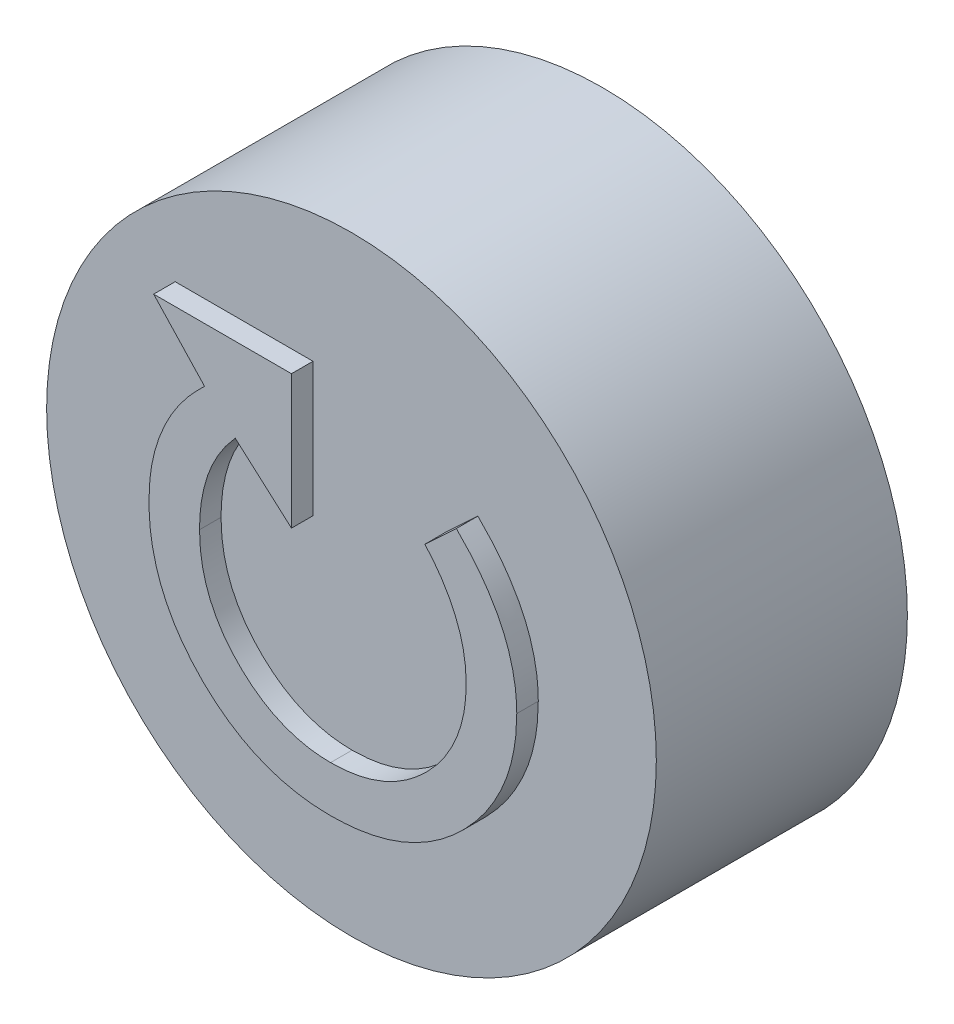
ISO-10303-21;
HEADER;
FILE_DESCRIPTION(('STEP AP214'),'2;1');
FILE_NAME('part.step','',(''),(''),'','','');
FILE_SCHEMA(('AUTOMOTIVE_DESIGN { 1 0 10303 214 1 1 1 1 }'));
ENDSEC;
DATA;
#1=APPLICATION_CONTEXT('core data for automotive mechanical design processes');
#2=APPLICATION_PROTOCOL_DEFINITION('international standard','automotive_design',2000,#1);
#3=PRODUCT_CONTEXT('',#1,'mechanical');
#4=PRODUCT('Part','Part','',(#3));
#5=PRODUCT_RELATED_PRODUCT_CATEGORY('part','',(#4));
#6=PRODUCT_DEFINITION_FORMATION('','',#4);
#7=PRODUCT_DEFINITION_CONTEXT('part definition',#1,'design');
#8=PRODUCT_DEFINITION('design','',#6,#7);
#9=PRODUCT_DEFINITION_SHAPE('','',#8);
#10=(LENGTH_UNIT() NAMED_UNIT(*) SI_UNIT(.MILLI.,.METRE.));
#11=(NAMED_UNIT(*) PLANE_ANGLE_UNIT() SI_UNIT($,.RADIAN.));
#12=(NAMED_UNIT(*) SI_UNIT($,.STERADIAN.) SOLID_ANGLE_UNIT());
#13=UNCERTAINTY_MEASURE_WITH_UNIT(LENGTH_MEASURE(1.E-05),#10,'distance_accuracy_value','');
#14=(GEOMETRIC_REPRESENTATION_CONTEXT(3) GLOBAL_UNCERTAINTY_ASSIGNED_CONTEXT((#13)) GLOBAL_UNIT_ASSIGNED_CONTEXT((#10,
#11,#12)) REPRESENTATION_CONTEXT('',''));
#15=CARTESIAN_POINT('',(0.,0.,0.));
#16=DIRECTION('',(0.,0.,1.));
#17=DIRECTION('',(1.,0.,0.));
#18=AXIS2_PLACEMENT_3D('',#15,#16,#17);
#19=CARTESIAN_POINT('',(0.,0.,7.));
#20=DIRECTION('',(0.,0.,-1.));
#21=DIRECTION('',(-1.,0.,0.));
#22=AXIS2_PLACEMENT_3D('',#19,#20,#21);
#23=CYLINDRICAL_SURFACE('',#22,8.5);
#24=CARTESIAN_POINT('',(0.,0.,7.));
#25=DIRECTION('',(0.,0.,1.));
#26=DIRECTION('',(1.,0.,0.));
#27=AXIS2_PLACEMENT_3D('',#24,#25,#26);
#28=CIRCLE('',#27,8.5);
#29=CARTESIAN_POINT('',(8.5,0.,7.));
#30=VERTEX_POINT('',#29);
#31=EDGE_CURVE('E11',#30,#30,#28,.T.);
#32=ORIENTED_EDGE('',*,*,#31,.F.);
#33=EDGE_LOOP('',(#32));
#34=FACE_BOUND('',#33,.T.);
#35=CARTESIAN_POINT('',(0.,0.,0.));
#36=DIRECTION('',(0.,0.,1.));
#37=DIRECTION('',(1.,0.,0.));
#38=AXIS2_PLACEMENT_3D('',#35,#36,#37);
#39=CIRCLE('',#38,8.5);
#40=CARTESIAN_POINT('',(8.5,0.,0.));
#41=VERTEX_POINT('',#40);
#42=EDGE_CURVE('E36',#41,#41,#39,.T.);
#43=ORIENTED_EDGE('',*,*,#42,.T.);
#44=EDGE_LOOP('',(#43));
#45=FACE_BOUND('',#44,.T.);
#46=ADVANCED_FACE('F33',(#34,#45),#23,.T.);
#47=CARTESIAN_POINT('',(0.,0.,7.));
#48=DIRECTION('',(0.,0.,1.));
#49=DIRECTION('',(1.,0.,0.));
#50=AXIS2_PLACEMENT_3D('',#47,#48,#49);
#51=PLANE('',#50);
#52=CARTESIAN_POINT('',(-5.04725794206006,-0.214827912026557,7.));
#53=CARTESIAN_POINT('',(-5.04271850051626,-0.0429710378883705,7.));
#54=CARTESIAN_POINT('',(-5.03375749189943,0.296280148662969,7.));
#55=CARTESIAN_POINT('',(-4.96030744431832,0.794688320536847,7.));
#56=CARTESIAN_POINT('',(-4.83825102799735,1.27222493293543,7.));
#57=CARTESIAN_POINT('',(-4.66550140220339,1.72792194736183,7.));
#58=CARTESIAN_POINT('',(-4.44975987457687,2.16538642824072,7.));
#59=CARTESIAN_POINT('',(-4.1800274857242,2.58002060059584,7.));
#60=CARTESIAN_POINT('',(-3.86306527315579,2.97477453377335,7.));
#61=CARTESIAN_POINT('',(-3.62010529242067,3.21494343262015,7.));
#62=CARTESIAN_POINT('',(-3.49677717282929,3.33685478028114,7.));
#63=B_SPLINE_CURVE_WITH_KNOTS('',3,(#52,#53,#54,#55,#56,#57,#58,#59,#60,#61,#62),.UNSPECIFIED.,
.F.,.F.,(4,1,1,1,1,1,1,1,4),(0.,0.12909571476395,0.254839235450938,0.377634876495286,
0.498790561136243,0.620414991060809,0.743451312714283,0.869774161609449,1.),.UNSPECIFIED.);
#64=CARTESIAN_POINT('',(-5.04725794206006,-0.214827912026557,7.));
#65=VERTEX_POINT('',#64);
#66=CARTESIAN_POINT('',(-3.49677717282929,3.33685478028114,7.));
#67=VERTEX_POINT('',#66);
#68=EDGE_CURVE('E231',#65,#67,#63,.T.);
#69=ORIENTED_EDGE('',*,*,#68,.T.);
#70=DIRECTION('',(-0.683074137091222,0.7303490420594,0.));
#71=VECTOR('',#70,1.);
#72=CARTESIAN_POINT('',(-3.49677717282929,3.33685478028114,7.));
#73=LINE('',#72,#71);
#74=CARTESIAN_POINT('',(-4.91504640359853,4.85328106233242,7.));
#75=VERTEX_POINT('',#74);
#76=EDGE_CURVE('E132',#67,#75,#73,.T.);
#77=ORIENTED_EDGE('',*,*,#76,.T.);
#78=DIRECTION('',(1.,0.,0.));
#79=VECTOR('',#78,1.);
#80=CARTESIAN_POINT('',(-4.91504640359853,4.85328106233242,7.));
#81=LINE('',#80,#79);
#82=CARTESIAN_POINT('',(-1.07289896770109,4.85328106233242,7.));
#83=VERTEX_POINT('',#82);
#84=EDGE_CURVE('E224',#75,#83,#81,.T.);
#85=ORIENTED_EDGE('',*,*,#84,.T.);
#86=DIRECTION('',(0.,-1.,0.));
#87=VECTOR('',#86,1.);
#88=CARTESIAN_POINT('',(-1.07289896770109,4.85328106233242,7.));
#89=LINE('',#88,#87);
#90=CARTESIAN_POINT('',(-1.07289896770109,1.12331311361447,7.));
#91=VERTEX_POINT('',#90);
#92=EDGE_CURVE('E227',#83,#91,#89,.T.);
#93=ORIENTED_EDGE('',*,*,#92,.T.);
#94=DIRECTION('',(-0.748832251376986,0.662759578804919,0.));
#95=VECTOR('',#94,1.);
#96=CARTESIAN_POINT('',(-1.07289896770109,1.12331311361447,7.));
#97=LINE('',#96,#95);
#98=CARTESIAN_POINT('',(-2.6414085830857,2.51153426746062,7.));
#99=VERTEX_POINT('',#98);
#100=EDGE_CURVE('E229',#91,#99,#97,.T.);
#101=ORIENTED_EDGE('',*,*,#100,.T.);
#102=CARTESIAN_POINT('',(-2.64140858308571,2.51153426746062,7.));
#103=CARTESIAN_POINT('',(-2.72075338406305,2.41885580061614,7.));
#104=CARTESIAN_POINT('',(-2.87832238434477,2.23480778249208,7.));
#105=CARTESIAN_POINT('',(-3.08032661421501,1.93387845172124,7.));
#106=CARTESIAN_POINT('',(-3.2533906872143,1.61912069049552,7.));
#107=CARTESIAN_POINT('',(-3.39566136618079,1.28737806522074,7.));
#108=CARTESIAN_POINT('',(-3.50220889477893,0.938351435762185,7.));
#109=CARTESIAN_POINT('',(-3.58116413577378,0.57399823943541,7.));
#110=CARTESIAN_POINT('',(-3.62760692389803,0.193691533542748,7.));
#111=CARTESIAN_POINT('',(-3.63383374874121,-0.0651289079165023,7.));
#112=CARTESIAN_POINT('',(-3.63700153180365,-0.19679906587271,7.));
#113=B_SPLINE_CURVE_WITH_KNOTS('',3,(#102,#103,#104,#105,#106,#107,#108,#109,#110,#111,#112),
.UNSPECIFIED.,.F.,.F.,(4,1,1,1,1,1,1,1,4),(0.,0.123801638311918,0.24585480260539,
0.367233723558422,0.488140148149551,0.611672254110844,0.737216325780297,0.866313619984036,1.),.UNSPECIFIED.);
#114=CARTESIAN_POINT('',(-3.63700153180365,-0.19679906587271,7.));
#115=VERTEX_POINT('',#114);
#116=EDGE_CURVE('E236',#99,#115,#113,.T.);
#117=ORIENTED_EDGE('',*,*,#116,.T.);
#118=CARTESIAN_POINT('',(-3.63700153180365,-0.19679906587271,7.));
#119=CARTESIAN_POINT('',(-3.63331408066545,-0.32849072239701,7.));
#120=CARTESIAN_POINT('',(-3.62608036208716,-0.586831876408981,7.));
#121=CARTESIAN_POINT('',(-3.57566642448999,-0.966879105989051,7.));
#122=CARTESIAN_POINT('',(-3.48901188954909,-1.3294775926465,7.));
#123=CARTESIAN_POINT('',(-3.37077329153254,-1.67782262238625,7.));
#124=CARTESIAN_POINT('',(-3.21550727225465,-2.00916852407805,7.));
#125=CARTESIAN_POINT('',(-3.02656356091177,-2.32436460759691,7.));
#126=CARTESIAN_POINT('',(-2.80395200985021,-2.62380068320256,7.));
#127=CARTESIAN_POINT('',(-2.54978480438134,-2.90225309442638,7.));
#128=CARTESIAN_POINT('',(-2.27370391144585,-3.15712938187733,7.));
#129=CARTESIAN_POINT('',(-1.98220657763372,-3.38071648073315,7.));
#130=CARTESIAN_POINT('',(-1.67906521090661,-3.57088401491369,7.));
#131=CARTESIAN_POINT('',(-1.36191188113965,-3.72322465585151,7.));
#132=CARTESIAN_POINT('',(-1.03423734312026,-3.84464052923315,7.));
#133=CARTESIAN_POINT('',(-0.694609322760675,-3.93099210864398,7.));
#134=CARTESIAN_POINT('',(-0.342601774957791,-3.98188832353613,7.));
#135=CARTESIAN_POINT('',(-0.104181125029081,-3.9891743116061,7.));
#136=CARTESIAN_POINT('',(0.0168446220425002,-3.99287278382143,7.));
#137=B_SPLINE_CURVE_WITH_KNOTS('',3,(#118,#119,#120,#121,#122,#123,#124,#125,#126,#127,#128,
#129,#130,#131,#132,#133,#134,#135,#136),.UNSPECIFIED.,.F.,.F.,(4,1,1,1,1,1,1,1,1,1,1,1,1,1,1,1,
4),(0.,0.0674531401930001,0.13232366073226,0.195956895440996,0.258153612870868,
0.320433980503655,0.383024470653763,0.44609815562943,0.511235049040732,0.575867067568982,
0.638327512539608,0.699166341795614,0.758828436119118,0.818238997815913,0.877886383154275,
0.938013373796332,1.),.UNSPECIFIED.);
#138=CARTESIAN_POINT('',(0.0168446220425002,-3.99287278382143,7.));
#139=VERTEX_POINT('',#138);
#140=EDGE_CURVE('E240',#115,#139,#137,.T.);
#141=ORIENTED_EDGE('',*,*,#140,.T.);
#142=CARTESIAN_POINT('',(0.0168446220425002,-3.99287278382143,7.));
#143=CARTESIAN_POINT('',(0.145225126962137,-3.98932805488018,7.));
#144=CARTESIAN_POINT('',(0.399045701650249,-3.98231978569209,7.));
#145=CARTESIAN_POINT('',(0.771483517752392,-3.92919273985722,7.));
#146=CARTESIAN_POINT('',(1.13005172423904,-3.84295950435857,7.));
#147=CARTESIAN_POINT('',(1.47317133928111,-3.72057509888469,7.));
#148=CARTESIAN_POINT('',(1.80192663393218,-3.56216143435116,7.));
#149=CARTESIAN_POINT('',(2.11786652589739,-3.3729421577643,7.));
#150=CARTESIAN_POINT('',(2.41516877973818,-3.14263346515322,7.));
#151=CARTESIAN_POINT('',(2.69719512452482,-2.88579245282369,7.));
#152=CARTESIAN_POINT('',(2.95389243245947,-2.60215495152266,7.));
#153=CARTESIAN_POINT('',(3.18212742697483,-2.30286854635304,7.));
#154=CARTESIAN_POINT('',(3.37033603766217,-1.98492283440979,7.));
#155=CARTESIAN_POINT('',(3.52893933181184,-1.65608054203316,7.));
#156=CARTESIAN_POINT('',(3.64800963905901,-1.31066922451644,7.));
#157=CARTESIAN_POINT('',(3.73821300958358,-0.953238154434022,7.));
#158=CARTESIAN_POINT('',(3.78771272734575,-0.579461220034629,7.));
#159=CARTESIAN_POINT('',(3.79512571605408,-0.325806083232148,7.));
#160=CARTESIAN_POINT('',(3.79889590409378,-0.19679906587271,7.));
#161=B_SPLINE_CURVE_WITH_KNOTS('',3,(#142,#143,#144,#145,#146,#147,#148,#149,#150,#151,#152,
#153,#154,#155,#156,#157,#158,#159,#160),.UNSPECIFIED.,.F.,.F.,(4,1,1,1,1,1,1,1,1,1,1,1,1,1,1,1,
4),(0.,0.0646007630317219,0.127721906127931,0.188940720403078,0.249959931685166,
0.310692459313279,0.372367176406845,0.43495005309043,0.499654772143133,0.564133019393705,
0.627251478102071,0.688752872698254,0.749788742494646,0.810695853284039,0.872321099406303,
0.935063510430103,1.),.UNSPECIFIED.);
#162=CARTESIAN_POINT('',(3.79889590409378,-0.19679906587271,7.));
#163=VERTEX_POINT('',#162);
#164=EDGE_CURVE('E247',#139,#163,#161,.T.);
#165=ORIENTED_EDGE('',*,*,#164,.T.);
#166=CARTESIAN_POINT('',(3.79889590409378,-0.19679906587271,7.));
#167=CARTESIAN_POINT('',(3.79545262151446,-0.0717385886677618,7.));
#168=CARTESIAN_POINT('',(3.78858897322258,0.177550022119719,7.));
#169=CARTESIAN_POINT('',(3.73251219779137,0.547316375812829,7.));
#170=CARTESIAN_POINT('',(3.64233971373529,0.909630300709953,7.));
#171=CARTESIAN_POINT('',(3.51540726231819,1.26393654917214,7.));
#172=CARTESIAN_POINT('',(3.3511104965537,1.60959598199037,7.));
#173=CARTESIAN_POINT('',(3.1545821208802,1.94979099059844,7.));
#174=CARTESIAN_POINT('',(2.91949989195167,2.28151407754317,7.));
#175=CARTESIAN_POINT('',(2.73901200467867,2.48963217128378,7.));
#176=CARTESIAN_POINT('',(2.64705295537583,2.59566888284524,7.));
#177=B_SPLINE_CURVE_WITH_KNOTS('',3,(#166,#167,#168,#169,#170,#171,#172,#173,#174,#175,#176),
.UNSPECIFIED.,.F.,.F.,(4,1,1,1,1,1,1,1,4),(0.,0.12129180224932,0.241776343401371,
0.361981863675425,0.483091851493172,0.606263726493907,0.732830605607413,0.86387649674244,1.),.UNSPECIFIED.);
#178=CARTESIAN_POINT('',(2.64705295537583,2.59566888284524,7.));
#179=VERTEX_POINT('',#178);
#180=EDGE_CURVE('E254',#163,#179,#177,.T.);
#181=ORIENTED_EDGE('',*,*,#180,.T.);
#182=DIRECTION('',(0.731721570919939,0.681603655103505,0.));
#183=VECTOR('',#182,1.);
#184=CARTESIAN_POINT('',(2.64705295537583,2.59566888284524,7.));
#185=LINE('',#184,#183);
#186=CARTESIAN_POINT('',(3.52445680152968,3.41297657515293,7.));
#187=VERTEX_POINT('',#186);
#188=EDGE_CURVE('E261',#179,#187,#185,.T.);
#189=ORIENTED_EDGE('',*,*,#188,.T.);
#190=CARTESIAN_POINT('',(3.52445680152968,3.41297657515293,7.));
#191=CARTESIAN_POINT('',(3.65827898503687,3.27550441153862,7.));
#192=CARTESIAN_POINT('',(3.91937114974255,3.00729099695995,7.));
#193=CARTESIAN_POINT('',(4.26439795920269,2.57868627695834,7.));
#194=CARTESIAN_POINT('',(4.55316334687753,2.13804040559032,7.));
#195=CARTESIAN_POINT('',(4.79524019550527,1.68988535981038,7.));
#196=CARTESIAN_POINT('',(4.98093052598507,1.22889074072938,7.));
#197=CARTESIAN_POINT('',(5.1102275605723,0.756857332361214,7.));
#198=CARTESIAN_POINT('',(5.19504556274354,0.275667109546229,7.));
#199=CARTESIAN_POINT('',(5.20443705795614,-0.0495437315780979,7.));
#200=CARTESIAN_POINT('',(5.20915231435019,-0.212824706898351,7.));
#201=B_SPLINE_CURVE_WITH_KNOTS('',3,(#190,#191,#192,#193,#194,#195,#196,#197,#198,#199,#200),
.UNSPECIFIED.,.F.,.F.,(4,1,1,1,1,1,1,1,4),(0.,0.139997314229799,0.27314007937464,
0.400898030451008,0.524105062614949,0.644399494659681,0.76277861761217,0.880896533002429,1.),.UNSPECIFIED.);
#202=CARTESIAN_POINT('',(5.20915231435019,-0.212824706898351,7.));
#203=VERTEX_POINT('',#202);
#204=EDGE_CURVE('E266',#187,#203,#201,.T.);
#205=ORIENTED_EDGE('',*,*,#204,.T.);
#206=CARTESIAN_POINT('',(5.20915231435019,-0.212824706898351,7.));
#207=CARTESIAN_POINT('',(5.2045402118977,-0.382014013176114,7.));
#208=CARTESIAN_POINT('',(5.19543959200067,-0.715859061705904,7.));
#209=CARTESIAN_POINT('',(5.12297080992379,-1.20701512791398,7.));
#210=CARTESIAN_POINT('',(5.00759557438453,-1.68061937125717,7.));
#211=CARTESIAN_POINT('',(4.84200500042678,-2.13657603883734,7.));
#212=CARTESIAN_POINT('',(4.62739782935857,-2.57409434598308,7.));
#213=CARTESIAN_POINT('',(4.37135826689121,-2.99731009360558,7.));
#214=CARTESIAN_POINT('',(4.06311266983891,-3.3995548401417,7.));
#215=CARTESIAN_POINT('',(3.71379589835694,-3.78024816518786,7.));
#216=CARTESIAN_POINT('',(3.331337364252,-4.13016080530874,7.));
#217=CARTESIAN_POINT('',(2.92289949061828,-4.43756538871825,7.));
#218=CARTESIAN_POINT('',(2.49085626214102,-4.69470434470523,7.));
#219=CARTESIAN_POINT('',(2.03885783180131,-4.9089884998246,7.));
#220=CARTESIAN_POINT('',(1.56324720077187,-5.07394191736866,7.));
#221=CARTESIAN_POINT('',(1.06625118394441,-5.18889152073862,7.));
#222=CARTESIAN_POINT('',(0.548487362610366,-5.2613644908055,7.));
#223=CARTESIAN_POINT('',(0.196039664670185,-5.27035368722033,7.));
#224=CARTESIAN_POINT('',(0.0168446220425002,-5.27492406587271,7.));
#225=B_SPLINE_CURVE_WITH_KNOTS('',3,(#206,#207,#208,#209,#210,#211,#212,#213,#214,#215,#216,
#217,#218,#219,#220,#221,#222,#223,#224),.UNSPECIFIED.,.F.,.F.,(4,1,1,1,1,1,1,1,1,1,1,1,1,1,1,1,
4),(0.,0.0629069909901138,0.1241283383802,0.184245500320721,0.243956500569916,0.304161328665318,
0.365242967319617,0.427633525571221,0.492322958892682,0.557195692600531,0.62018108094288,
0.682113178035427,0.743886206753878,0.805937710314147,0.868952472517846,0.933371483455106,1.),.UNSPECIFIED.);
#226=CARTESIAN_POINT('',(0.0168446220425002,-5.27492406587271,7.));
#227=VERTEX_POINT('',#226);
#228=EDGE_CURVE('E52',#203,#227,#225,.T.);
#229=ORIENTED_EDGE('',*,*,#228,.T.);
#230=CARTESIAN_POINT('',(0.0168446220425002,-5.27492406587271,7.));
#231=CARTESIAN_POINT('',(-0.154981036662523,-5.27010154929076,7.));
#232=CARTESIAN_POINT('',(-0.493322305936787,-5.26060554971926,7.));
#233=CARTESIAN_POINT('',(-0.991507141681423,-5.1914642000928,7.));
#234=CARTESIAN_POINT('',(-1.4700013575387,-5.07522348025355,7.));
#235=CARTESIAN_POINT('',(-1.9296931112085,-4.91178645560594,7.));
#236=CARTESIAN_POINT('',(-2.37027031563655,-4.70282652875267,7.));
#237=CARTESIAN_POINT('',(-2.79114593607283,-4.44614967726849,7.));
#238=CARTESIAN_POINT('',(-3.19294881727765,-4.14431338048743,7.));
#239=CARTESIAN_POINT('',(-3.57070976036236,-3.80032278169779,7.));
#240=CARTESIAN_POINT('',(-3.91375647540008,-3.42213791671249,7.));
#241=CARTESIAN_POINT('',(-4.21934163827973,-3.02329553151708,7.));
#242=CARTESIAN_POINT('',(-4.47495269903356,-2.60178794164747,7.));
#243=CARTESIAN_POINT('',(-4.68417563263973,-2.16140688891324,7.));
#244=CARTESIAN_POINT('',(-4.84754236116259,-1.7016627080575,7.));
#245=CARTESIAN_POINT('',(-4.96380217160115,-1.22318273006046,7.));
#246=CARTESIAN_POINT('',(-5.03293835612336,-0.724994042156372,7.));
#247=CARTESIAN_POINT('',(-5.04243506517209,-0.38665330201363,7.));
#248=CARTESIAN_POINT('',(-5.04725794206006,-0.214827912026557,7.));
#249=B_SPLINE_CURVE_WITH_KNOTS('',3,(#230,#231,#232,#233,#234,#235,#236,#237,#238,#239,#240,
#241,#242,#243,#244,#245,#246,#247,#248),.UNSPECIFIED.,.F.,.F.,(4,1,1,1,1,1,1,1,1,1,1,1,1,1,1,1,
4),(0.,0.0647278278624448,0.127455326529212,0.189084958899807,0.249958687828805,
0.310952911603898,0.372480784628169,0.435377071825145,0.500024665017061,0.564672258208977,
0.627519215371831,0.689047088396102,0.750041312171195,0.810915041100193,0.872544673470788,
0.935272172137555,1.),.UNSPECIFIED.);
#250=EDGE_CURVE('E47',#227,#65,#249,.T.);
#251=ORIENTED_EDGE('',*,*,#250,.T.);
#252=EDGE_LOOP('',(#69,#77,#85,#93,#101,#117,#141,#165,#181,#189,#205,#229,#251));
#253=FACE_BOUND('',#252,.T.);
#254=ORIENTED_EDGE('',*,*,#31,.T.);
#255=EDGE_LOOP('',(#254));
#256=FACE_BOUND('',#255,.T.);
#257=ADVANCED_FACE('F171',(#253,#256),#51,.T.);
#258=CARTESIAN_POINT('',(0.,0.,0.));
#259=DIRECTION('',(0.,0.,1.));
#260=DIRECTION('',(1.,0.,0.));
#261=AXIS2_PLACEMENT_3D('',#258,#259,#260);
#262=PLANE('',#261);
#263=CARTESIAN_POINT('',(0.,0.,0.));
#264=DIRECTION('',(0.,0.,-1.));
#265=DIRECTION('',(-1.,0.,0.));
#266=AXIS2_PLACEMENT_3D('',#263,#264,#265);
#267=CIRCLE('',#266,5.8);
#268=CARTESIAN_POINT('',(-5.8,0.,0.));
#269=VERTEX_POINT('',#268);
#270=EDGE_CURVE('E158',#269,#269,#267,.T.);
#271=ORIENTED_EDGE('',*,*,#270,.F.);
#272=EDGE_LOOP('',(#271));
#273=FACE_BOUND('',#272,.T.);
#274=ORIENTED_EDGE('',*,*,#42,.F.);
#275=EDGE_LOOP('',(#274));
#276=FACE_BOUND('',#275,.T.);
#277=ADVANCED_FACE('F169',(#273,#276),#262,.F.);
#278=CARTESIAN_POINT('',(-5.04725794206006,-0.214827912026557,7.6));
#279=CARTESIAN_POINT('',(-5.04271850051626,-0.0429710378883705,7.6));
#280=CARTESIAN_POINT('',(-5.03375749189943,0.296280148662969,7.6));
#281=CARTESIAN_POINT('',(-4.96030744431832,0.794688320536847,7.6));
#282=CARTESIAN_POINT('',(-4.83825102799735,1.27222493293543,7.6));
#283=CARTESIAN_POINT('',(-4.66550140220339,1.72792194736183,7.6));
#284=CARTESIAN_POINT('',(-4.44975987457687,2.16538642824072,7.6));
#285=CARTESIAN_POINT('',(-4.1800274857242,2.58002060059584,7.6));
#286=CARTESIAN_POINT('',(-3.86306527315579,2.97477453377335,7.6));
#287=CARTESIAN_POINT('',(-3.62010529242067,3.21494343262015,7.6));
#288=CARTESIAN_POINT('',(-3.49677717282929,3.33685478028114,7.6));
#289=B_SPLINE_CURVE_WITH_KNOTS('',3,(#278,#279,#280,#281,#282,#283,#284,#285,#286,#287,#288),
.UNSPECIFIED.,.F.,.F.,(4,1,1,1,1,1,1,1,4),(0.,0.12909571476395,0.254839235450938,
0.377634876495286,0.498790561136243,0.620414991060809,0.743451312714283,0.869774161609449,1.),.UNSPECIFIED.);
#290=DIRECTION('',(0.,0.,-1.));
#291=VECTOR('',#290,1.);
#292=SURFACE_OF_LINEAR_EXTRUSION('',#289,#291);
#293=ORIENTED_EDGE('',*,*,#68,.F.);
#294=DIRECTION('',(0.,0.,-1.));
#295=VECTOR('',#294,1.);
#296=CARTESIAN_POINT('',(-5.04725794206006,-0.214827912026557,7.6));
#297=LINE('',#296,#295);
#298=CARTESIAN_POINT('',(-5.04725794206006,-0.214827912026557,7.6));
#299=VERTEX_POINT('',#298);
#300=EDGE_CURVE('E151',#299,#65,#297,.T.);
#301=ORIENTED_EDGE('',*,*,#300,.F.);
#302=CARTESIAN_POINT('',(-3.49677717282929,3.33685478028114,7.6));
#303=VERTEX_POINT('',#302);
#304=EDGE_CURVE('E144',#299,#303,#289,.T.);
#305=ORIENTED_EDGE('',*,*,#304,.T.);
#306=DIRECTION('',(0.,0.,-1.));
#307=VECTOR('',#306,1.);
#308=CARTESIAN_POINT('',(-3.49677717282929,3.33685478028114,7.6));
#309=LINE('',#308,#307);
#310=EDGE_CURVE('E127',#303,#67,#309,.T.);
#311=ORIENTED_EDGE('',*,*,#310,.T.);
#312=EDGE_LOOP('',(#293,#301,#305,#311));
#313=FACE_BOUND('',#312,.T.);
#314=ADVANCED_FACE('F150',(#313),#292,.T.);
#315=CARTESIAN_POINT('',(0.0168446220425002,-5.27492406587271,7.6));
#316=CARTESIAN_POINT('',(-0.154981036662523,-5.27010154929076,7.6));
#317=CARTESIAN_POINT('',(-0.493322305936787,-5.26060554971926,7.6));
#318=CARTESIAN_POINT('',(-0.991507141681423,-5.1914642000928,7.6));
#319=CARTESIAN_POINT('',(-1.4700013575387,-5.07522348025355,7.6));
#320=CARTESIAN_POINT('',(-1.9296931112085,-4.91178645560594,7.6));
#321=CARTESIAN_POINT('',(-2.37027031563655,-4.70282652875267,7.6));
#322=CARTESIAN_POINT('',(-2.79114593607283,-4.44614967726849,7.6));
#323=CARTESIAN_POINT('',(-3.19294881727765,-4.14431338048743,7.6));
#324=CARTESIAN_POINT('',(-3.57070976036236,-3.80032278169779,7.6));
#325=CARTESIAN_POINT('',(-3.91375647540008,-3.42213791671249,7.6));
#326=CARTESIAN_POINT('',(-4.21934163827973,-3.02329553151708,7.6));
#327=CARTESIAN_POINT('',(-4.47495269903356,-2.60178794164747,7.6));
#328=CARTESIAN_POINT('',(-4.68417563263973,-2.16140688891324,7.6));
#329=CARTESIAN_POINT('',(-4.84754236116259,-1.7016627080575,7.6));
#330=CARTESIAN_POINT('',(-4.96380217160115,-1.22318273006046,7.6));
#331=CARTESIAN_POINT('',(-5.03293835612336,-0.724994042156372,7.6));
#332=CARTESIAN_POINT('',(-5.04243506517209,-0.38665330201363,7.6));
#333=CARTESIAN_POINT('',(-5.04725794206006,-0.214827912026557,7.6));
#334=B_SPLINE_CURVE_WITH_KNOTS('',3,(#315,#316,#317,#318,#319,#320,#321,#322,#323,#324,#325,
#326,#327,#328,#329,#330,#331,#332,#333),.UNSPECIFIED.,.F.,.F.,(4,1,1,1,1,1,1,1,1,1,1,1,1,1,1,1,
4),(0.,0.0647278278624448,0.127455326529212,0.189084958899807,0.249958687828805,
0.310952911603898,0.372480784628169,0.435377071825145,0.500024665017061,0.564672258208977,
0.627519215371831,0.689047088396102,0.750041312171195,0.810915041100193,0.872544673470788,
0.935272172137555,1.),.UNSPECIFIED.);
#335=DIRECTION('',(0.,0.,-1.));
#336=VECTOR('',#335,1.);
#337=SURFACE_OF_LINEAR_EXTRUSION('',#334,#336);
#338=ORIENTED_EDGE('',*,*,#250,.F.);
#339=DIRECTION('',(0.,0.,-1.));
#340=VECTOR('',#339,1.);
#341=CARTESIAN_POINT('',(0.0168446220425002,-5.27492406587271,7.6));
#342=LINE('',#341,#340);
#343=CARTESIAN_POINT('',(0.0168446220425002,-5.27492406587271,7.6));
#344=VERTEX_POINT('',#343);
#345=EDGE_CURVE('E187',#344,#227,#342,.T.);
#346=ORIENTED_EDGE('',*,*,#345,.F.);
#347=EDGE_CURVE('E137',#344,#299,#334,.T.);
#348=ORIENTED_EDGE('',*,*,#347,.T.);
#349=ORIENTED_EDGE('',*,*,#300,.T.);
#350=EDGE_LOOP('',(#338,#346,#348,#349));
#351=FACE_BOUND('',#350,.T.);
#352=ADVANCED_FACE('F168',(#351),#337,.T.);
#353=CARTESIAN_POINT('',(5.20915231435019,-0.212824706898351,7.6));
#354=CARTESIAN_POINT('',(5.2045402118977,-0.382014013176114,7.6));
#355=CARTESIAN_POINT('',(5.19543959200067,-0.715859061705904,7.6));
#356=CARTESIAN_POINT('',(5.12297080992379,-1.20701512791398,7.6));
#357=CARTESIAN_POINT('',(5.00759557438453,-1.68061937125717,7.6));
#358=CARTESIAN_POINT('',(4.84200500042678,-2.13657603883734,7.6));
#359=CARTESIAN_POINT('',(4.62739782935857,-2.57409434598308,7.6));
#360=CARTESIAN_POINT('',(4.37135826689121,-2.99731009360558,7.6));
#361=CARTESIAN_POINT('',(4.06311266983891,-3.3995548401417,7.6));
#362=CARTESIAN_POINT('',(3.71379589835694,-3.78024816518786,7.6));
#363=CARTESIAN_POINT('',(3.331337364252,-4.13016080530874,7.6));
#364=CARTESIAN_POINT('',(2.92289949061828,-4.43756538871825,7.6));
#365=CARTESIAN_POINT('',(2.49085626214102,-4.69470434470523,7.6));
#366=CARTESIAN_POINT('',(2.03885783180131,-4.9089884998246,7.6));
#367=CARTESIAN_POINT('',(1.56324720077187,-5.07394191736866,7.6));
#368=CARTESIAN_POINT('',(1.06625118394441,-5.18889152073862,7.6));
#369=CARTESIAN_POINT('',(0.548487362610366,-5.2613644908055,7.6));
#370=CARTESIAN_POINT('',(0.196039664670185,-5.27035368722033,7.6));
#371=CARTESIAN_POINT('',(0.0168446220425002,-5.27492406587271,7.6));
#372=B_SPLINE_CURVE_WITH_KNOTS('',3,(#353,#354,#355,#356,#357,#358,#359,#360,#361,#362,#363,
#364,#365,#366,#367,#368,#369,#370,#371),.UNSPECIFIED.,.F.,.F.,(4,1,1,1,1,1,1,1,1,1,1,1,1,1,1,1,
4),(0.,0.0629069909901138,0.1241283383802,0.184245500320721,0.243956500569916,0.304161328665318,
0.365242967319617,0.427633525571221,0.492322958892682,0.557195692600531,0.62018108094288,
0.682113178035427,0.743886206753878,0.805937710314147,0.868952472517846,0.933371483455106,1.),.UNSPECIFIED.);
#373=DIRECTION('',(0.,0.,-1.));
#374=VECTOR('',#373,1.);
#375=SURFACE_OF_LINEAR_EXTRUSION('',#372,#374);
#376=ORIENTED_EDGE('',*,*,#228,.F.);
#377=DIRECTION('',(0.,0.,-1.));
#378=VECTOR('',#377,1.);
#379=CARTESIAN_POINT('',(5.20915231435019,-0.212824706898351,7.6));
#380=LINE('',#379,#378);
#381=CARTESIAN_POINT('',(5.20915231435019,-0.212824706898351,7.6));
#382=VERTEX_POINT('',#381);
#383=EDGE_CURVE('E190',#382,#203,#380,.T.);
#384=ORIENTED_EDGE('',*,*,#383,.F.);
#385=EDGE_CURVE('E289',#382,#344,#372,.T.);
#386=ORIENTED_EDGE('',*,*,#385,.T.);
#387=ORIENTED_EDGE('',*,*,#345,.T.);
#388=EDGE_LOOP('',(#376,#384,#386,#387));
#389=FACE_BOUND('',#388,.T.);
#390=ADVANCED_FACE('F288',(#389),#375,.T.);
#391=CARTESIAN_POINT('',(3.52445680152968,3.41297657515293,7.6));
#392=CARTESIAN_POINT('',(3.65827898503687,3.27550441153862,7.6));
#393=CARTESIAN_POINT('',(3.91937114974255,3.00729099695995,7.6));
#394=CARTESIAN_POINT('',(4.26439795920269,2.57868627695834,7.6));
#395=CARTESIAN_POINT('',(4.55316334687753,2.13804040559032,7.6));
#396=CARTESIAN_POINT('',(4.79524019550527,1.68988535981038,7.6));
#397=CARTESIAN_POINT('',(4.98093052598507,1.22889074072938,7.6));
#398=CARTESIAN_POINT('',(5.1102275605723,0.756857332361214,7.6));
#399=CARTESIAN_POINT('',(5.19504556274354,0.275667109546229,7.6));
#400=CARTESIAN_POINT('',(5.20443705795614,-0.0495437315780979,7.6));
#401=CARTESIAN_POINT('',(5.20915231435019,-0.212824706898351,7.6));
#402=B_SPLINE_CURVE_WITH_KNOTS('',3,(#391,#392,#393,#394,#395,#396,#397,#398,#399,#400,#401),
.UNSPECIFIED.,.F.,.F.,(4,1,1,1,1,1,1,1,4),(0.,0.139997314229799,0.27314007937464,
0.400898030451008,0.524105062614949,0.644399494659681,0.76277861761217,0.880896533002429,1.),.UNSPECIFIED.);
#403=DIRECTION('',(0.,0.,-1.));
#404=VECTOR('',#403,1.);
#405=SURFACE_OF_LINEAR_EXTRUSION('',#402,#404);
#406=ORIENTED_EDGE('',*,*,#204,.F.);
#407=DIRECTION('',(0.,0.,-1.));
#408=VECTOR('',#407,1.);
#409=CARTESIAN_POINT('',(3.52445680152968,3.41297657515293,7.6));
#410=LINE('',#409,#408);
#411=CARTESIAN_POINT('',(3.52445680152968,3.41297657515293,7.6));
#412=VERTEX_POINT('',#411);
#413=EDGE_CURVE('E198',#412,#187,#410,.T.);
#414=ORIENTED_EDGE('',*,*,#413,.F.);
#415=EDGE_CURVE('E284',#412,#382,#402,.T.);
#416=ORIENTED_EDGE('',*,*,#415,.T.);
#417=ORIENTED_EDGE('',*,*,#383,.T.);
#418=EDGE_LOOP('',(#406,#414,#416,#417));
#419=FACE_BOUND('',#418,.T.);
#420=ADVANCED_FACE('F282',(#419),#405,.T.);
#421=CARTESIAN_POINT('',(2.64705295537583,2.59566888284524,7.6));
#422=DIRECTION('',(-0.681603655103505,0.731721570919939,0.));
#423=DIRECTION('',(-0.731721570919939,-0.681603655103505,0.));
#424=AXIS2_PLACEMENT_3D('',#421,#422,#423);
#425=PLANE('',#424);
#426=ORIENTED_EDGE('',*,*,#188,.F.);
#427=DIRECTION('',(0.,0.,-1.));
#428=VECTOR('',#427,1.);
#429=CARTESIAN_POINT('',(2.64705295537583,2.59566888284524,7.6));
#430=LINE('',#429,#428);
#431=CARTESIAN_POINT('',(2.64705295537583,2.59566888284524,7.6));
#432=VERTEX_POINT('',#431);
#433=EDGE_CURVE('E201',#432,#179,#430,.T.);
#434=ORIENTED_EDGE('',*,*,#433,.F.);
#435=DIRECTION('',(0.731721570919939,0.681603655103505,0.));
#436=VECTOR('',#435,1.);
#437=CARTESIAN_POINT('',(2.64705295537583,2.59566888284524,7.6));
#438=LINE('',#437,#436);
#439=EDGE_CURVE('E405',#432,#412,#438,.T.);
#440=ORIENTED_EDGE('',*,*,#439,.T.);
#441=ORIENTED_EDGE('',*,*,#413,.T.);
#442=EDGE_LOOP('',(#426,#434,#440,#441));
#443=FACE_BOUND('',#442,.T.);
#444=ADVANCED_FACE('F397',(#443),#425,.T.);
#445=CARTESIAN_POINT('',(3.79889590409378,-0.19679906587271,7.6));
#446=CARTESIAN_POINT('',(3.79545262151446,-0.0717385886677618,7.6));
#447=CARTESIAN_POINT('',(3.78858897322258,0.177550022119719,7.6));
#448=CARTESIAN_POINT('',(3.73251219779137,0.547316375812829,7.6));
#449=CARTESIAN_POINT('',(3.64233971373529,0.909630300709953,7.6));
#450=CARTESIAN_POINT('',(3.51540726231819,1.26393654917214,7.6));
#451=CARTESIAN_POINT('',(3.3511104965537,1.60959598199037,7.6));
#452=CARTESIAN_POINT('',(3.1545821208802,1.94979099059844,7.6));
#453=CARTESIAN_POINT('',(2.91949989195167,2.28151407754317,7.6));
#454=CARTESIAN_POINT('',(2.73901200467867,2.48963217128378,7.6));
#455=CARTESIAN_POINT('',(2.64705295537583,2.59566888284524,7.6));
#456=B_SPLINE_CURVE_WITH_KNOTS('',3,(#445,#446,#447,#448,#449,#450,#451,#452,#453,#454,#455),
.UNSPECIFIED.,.F.,.F.,(4,1,1,1,1,1,1,1,4),(0.,0.12129180224932,0.241776343401371,
0.361981863675425,0.483091851493172,0.606263726493907,0.732830605607413,0.86387649674244,1.),.UNSPECIFIED.);
#457=DIRECTION('',(0.,0.,-1.));
#458=VECTOR('',#457,1.);
#459=SURFACE_OF_LINEAR_EXTRUSION('',#456,#458);
#460=ORIENTED_EDGE('',*,*,#180,.F.);
#461=DIRECTION('',(0.,0.,-1.));
#462=VECTOR('',#461,1.);
#463=CARTESIAN_POINT('',(3.79889590409378,-0.19679906587271,7.6));
#464=LINE('',#463,#462);
#465=CARTESIAN_POINT('',(3.79889590409378,-0.19679906587271,7.6));
#466=VERTEX_POINT('',#465);
#467=EDGE_CURVE('E204',#466,#163,#464,.T.);
#468=ORIENTED_EDGE('',*,*,#467,.F.);
#469=EDGE_CURVE('E382',#466,#432,#456,.T.);
#470=ORIENTED_EDGE('',*,*,#469,.T.);
#471=ORIENTED_EDGE('',*,*,#433,.T.);
#472=EDGE_LOOP('',(#460,#468,#470,#471));
#473=FACE_BOUND('',#472,.T.);
#474=ADVANCED_FACE('F393',(#473),#459,.T.);
#475=CARTESIAN_POINT('',(0.0168446220425002,-3.99287278382143,7.6));
#476=CARTESIAN_POINT('',(0.145225126962137,-3.98932805488018,7.6));
#477=CARTESIAN_POINT('',(0.399045701650249,-3.98231978569209,7.6));
#478=CARTESIAN_POINT('',(0.771483517752392,-3.92919273985722,7.6));
#479=CARTESIAN_POINT('',(1.13005172423904,-3.84295950435857,7.6));
#480=CARTESIAN_POINT('',(1.47317133928111,-3.72057509888469,7.6));
#481=CARTESIAN_POINT('',(1.80192663393218,-3.56216143435116,7.6));
#482=CARTESIAN_POINT('',(2.11786652589739,-3.3729421577643,7.6));
#483=CARTESIAN_POINT('',(2.41516877973818,-3.14263346515322,7.6));
#484=CARTESIAN_POINT('',(2.69719512452482,-2.88579245282369,7.6));
#485=CARTESIAN_POINT('',(2.95389243245947,-2.60215495152266,7.6));
#486=CARTESIAN_POINT('',(3.18212742697483,-2.30286854635304,7.6));
#487=CARTESIAN_POINT('',(3.37033603766217,-1.98492283440979,7.6));
#488=CARTESIAN_POINT('',(3.52893933181184,-1.65608054203316,7.6));
#489=CARTESIAN_POINT('',(3.64800963905901,-1.31066922451644,7.6));
#490=CARTESIAN_POINT('',(3.73821300958358,-0.953238154434022,7.6));
#491=CARTESIAN_POINT('',(3.78771272734575,-0.579461220034629,7.6));
#492=CARTESIAN_POINT('',(3.79512571605408,-0.325806083232148,7.6));
#493=CARTESIAN_POINT('',(3.79889590409378,-0.19679906587271,7.6));
#494=B_SPLINE_CURVE_WITH_KNOTS('',3,(#475,#476,#477,#478,#479,#480,#481,#482,#483,#484,#485,
#486,#487,#488,#489,#490,#491,#492,#493),.UNSPECIFIED.,.F.,.F.,(4,1,1,1,1,1,1,1,1,1,1,1,1,1,1,1,
4),(0.,0.0646007630317219,0.127721906127931,0.188940720403078,0.249959931685166,
0.310692459313279,0.372367176406845,0.43495005309043,0.499654772143133,0.564133019393705,
0.627251478102071,0.688752872698254,0.749788742494646,0.810695853284039,0.872321099406303,
0.935063510430103,1.),.UNSPECIFIED.);
#495=DIRECTION('',(0.,0.,-1.));
#496=VECTOR('',#495,1.);
#497=SURFACE_OF_LINEAR_EXTRUSION('',#494,#496);
#498=ORIENTED_EDGE('',*,*,#164,.F.);
#499=DIRECTION('',(0.,0.,-1.));
#500=VECTOR('',#499,1.);
#501=CARTESIAN_POINT('',(0.0168446220425002,-3.99287278382143,7.6));
#502=LINE('',#501,#500);
#503=CARTESIAN_POINT('',(0.0168446220425002,-3.99287278382143,7.6));
#504=VERTEX_POINT('',#503);
#505=EDGE_CURVE('E207',#504,#139,#502,.T.);
#506=ORIENTED_EDGE('',*,*,#505,.F.);
#507=EDGE_CURVE('E373',#504,#466,#494,.T.);
#508=ORIENTED_EDGE('',*,*,#507,.T.);
#509=ORIENTED_EDGE('',*,*,#467,.T.);
#510=EDGE_LOOP('',(#498,#506,#508,#509));
#511=FACE_BOUND('',#510,.T.);
#512=ADVANCED_FACE('F390',(#511),#497,.T.);
#513=CARTESIAN_POINT('',(-3.63700153180365,-0.19679906587271,7.6));
#514=CARTESIAN_POINT('',(-3.63331408066545,-0.32849072239701,7.6));
#515=CARTESIAN_POINT('',(-3.62608036208716,-0.586831876408981,7.6));
#516=CARTESIAN_POINT('',(-3.57566642448999,-0.966879105989051,7.6));
#517=CARTESIAN_POINT('',(-3.48901188954909,-1.3294775926465,7.6));
#518=CARTESIAN_POINT('',(-3.37077329153254,-1.67782262238625,7.6));
#519=CARTESIAN_POINT('',(-3.21550727225465,-2.00916852407805,7.6));
#520=CARTESIAN_POINT('',(-3.02656356091177,-2.32436460759691,7.6));
#521=CARTESIAN_POINT('',(-2.80395200985021,-2.62380068320256,7.6));
#522=CARTESIAN_POINT('',(-2.54978480438134,-2.90225309442638,7.6));
#523=CARTESIAN_POINT('',(-2.27370391144585,-3.15712938187733,7.6));
#524=CARTESIAN_POINT('',(-1.98220657763372,-3.38071648073315,7.6));
#525=CARTESIAN_POINT('',(-1.67906521090661,-3.57088401491369,7.6));
#526=CARTESIAN_POINT('',(-1.36191188113965,-3.72322465585151,7.6));
#527=CARTESIAN_POINT('',(-1.03423734312026,-3.84464052923315,7.6));
#528=CARTESIAN_POINT('',(-0.694609322760675,-3.93099210864398,7.6));
#529=CARTESIAN_POINT('',(-0.342601774957791,-3.98188832353613,7.6));
#530=CARTESIAN_POINT('',(-0.104181125029081,-3.9891743116061,7.6));
#531=CARTESIAN_POINT('',(0.0168446220425002,-3.99287278382143,7.6));
#532=B_SPLINE_CURVE_WITH_KNOTS('',3,(#513,#514,#515,#516,#517,#518,#519,#520,#521,#522,#523,
#524,#525,#526,#527,#528,#529,#530,#531),.UNSPECIFIED.,.F.,.F.,(4,1,1,1,1,1,1,1,1,1,1,1,1,1,1,1,
4),(0.,0.0674531401930001,0.13232366073226,0.195956895440996,0.258153612870868,
0.320433980503655,0.383024470653763,0.44609815562943,0.511235049040732,0.575867067568982,
0.638327512539608,0.699166341795614,0.758828436119118,0.818238997815913,0.877886383154275,
0.938013373796332,1.),.UNSPECIFIED.);
#533=DIRECTION('',(0.,0.,-1.));
#534=VECTOR('',#533,1.);
#535=SURFACE_OF_LINEAR_EXTRUSION('',#532,#534);
#536=ORIENTED_EDGE('',*,*,#140,.F.);
#537=DIRECTION('',(0.,0.,-1.));
#538=VECTOR('',#537,1.);
#539=CARTESIAN_POINT('',(-3.63700153180365,-0.19679906587271,7.6));
#540=LINE('',#539,#538);
#541=CARTESIAN_POINT('',(-3.63700153180365,-0.19679906587271,7.6));
#542=VERTEX_POINT('',#541);
#543=EDGE_CURVE('E210',#542,#115,#540,.T.);
#544=ORIENTED_EDGE('',*,*,#543,.F.);
#545=EDGE_CURVE('E362',#542,#504,#532,.T.);
#546=ORIENTED_EDGE('',*,*,#545,.T.);
#547=ORIENTED_EDGE('',*,*,#505,.T.);
#548=EDGE_LOOP('',(#536,#544,#546,#547));
#549=FACE_BOUND('',#548,.T.);
#550=ADVANCED_FACE('F352',(#549),#535,.T.);
#551=CARTESIAN_POINT('',(-2.64140858308571,2.51153426746062,7.6));
#552=CARTESIAN_POINT('',(-2.72075338406305,2.41885580061614,7.6));
#553=CARTESIAN_POINT('',(-2.87832238434477,2.23480778249208,7.6));
#554=CARTESIAN_POINT('',(-3.08032661421501,1.93387845172124,7.6));
#555=CARTESIAN_POINT('',(-3.2533906872143,1.61912069049552,7.6));
#556=CARTESIAN_POINT('',(-3.39566136618079,1.28737806522074,7.6));
#557=CARTESIAN_POINT('',(-3.50220889477893,0.938351435762185,7.6));
#558=CARTESIAN_POINT('',(-3.58116413577378,0.57399823943541,7.6));
#559=CARTESIAN_POINT('',(-3.62760692389803,0.193691533542748,7.6));
#560=CARTESIAN_POINT('',(-3.63383374874121,-0.0651289079165023,7.6));
#561=CARTESIAN_POINT('',(-3.63700153180365,-0.19679906587271,7.6));
#562=B_SPLINE_CURVE_WITH_KNOTS('',3,(#551,#552,#553,#554,#555,#556,#557,#558,#559,#560,#561),
.UNSPECIFIED.,.F.,.F.,(4,1,1,1,1,1,1,1,4),(0.,0.123801638311918,0.24585480260539,
0.367233723558422,0.488140148149551,0.611672254110844,0.737216325780297,0.866313619984036,1.),.UNSPECIFIED.);
#563=DIRECTION('',(0.,0.,-1.));
#564=VECTOR('',#563,1.);
#565=SURFACE_OF_LINEAR_EXTRUSION('',#562,#564);
#566=ORIENTED_EDGE('',*,*,#116,.F.);
#567=DIRECTION('',(0.,0.,-1.));
#568=VECTOR('',#567,1.);
#569=CARTESIAN_POINT('',(-2.6414085830857,2.51153426746062,7.6));
#570=LINE('',#569,#568);
#571=CARTESIAN_POINT('',(-2.6414085830857,2.51153426746062,7.6));
#572=VERTEX_POINT('',#571);
#573=EDGE_CURVE('E213',#572,#99,#570,.T.);
#574=ORIENTED_EDGE('',*,*,#573,.F.);
#575=EDGE_CURVE('E356',#572,#542,#562,.T.);
#576=ORIENTED_EDGE('',*,*,#575,.T.);
#577=ORIENTED_EDGE('',*,*,#543,.T.);
#578=EDGE_LOOP('',(#566,#574,#576,#577));
#579=FACE_BOUND('',#578,.T.);
#580=ADVANCED_FACE('F347',(#579),#565,.T.);
#581=CARTESIAN_POINT('',(-1.07289896770109,1.12331311361447,7.6));
#582=DIRECTION('',(-0.662759578804919,-0.748832251376987,0.));
#583=DIRECTION('',(0.748832251376987,-0.662759578804919,0.));
#584=AXIS2_PLACEMENT_3D('',#581,#582,#583);
#585=PLANE('',#584);
#586=ORIENTED_EDGE('',*,*,#100,.F.);
#587=DIRECTION('',(0.,0.,-1.));
#588=VECTOR('',#587,1.);
#589=CARTESIAN_POINT('',(-1.07289896770109,1.12331311361447,7.6));
#590=LINE('',#589,#588);
#591=CARTESIAN_POINT('',(-1.07289896770109,1.12331311361447,7.6));
#592=VERTEX_POINT('',#591);
#593=EDGE_CURVE('E216',#592,#91,#590,.T.);
#594=ORIENTED_EDGE('',*,*,#593,.F.);
#595=DIRECTION('',(-0.748832251376986,0.662759578804919,0.));
#596=VECTOR('',#595,1.);
#597=CARTESIAN_POINT('',(-1.07289896770109,1.12331311361447,7.6));
#598=LINE('',#597,#596);
#599=EDGE_CURVE('E363',#592,#572,#598,.T.);
#600=ORIENTED_EDGE('',*,*,#599,.T.);
#601=ORIENTED_EDGE('',*,*,#573,.T.);
#602=EDGE_LOOP('',(#586,#594,#600,#601));
#603=FACE_BOUND('',#602,.T.);
#604=ADVANCED_FACE('F341',(#603),#585,.T.);
#605=CARTESIAN_POINT('',(-1.07289896770109,4.85328106233242,7.6));
#606=DIRECTION('',(1.,0.,0.));
#607=DIRECTION('',(0.,0.,-1.));
#608=AXIS2_PLACEMENT_3D('',#605,#606,#607);
#609=PLANE('',#608);
#610=ORIENTED_EDGE('',*,*,#92,.F.);
#611=DIRECTION('',(0.,0.,-1.));
#612=VECTOR('',#611,1.);
#613=CARTESIAN_POINT('',(-1.07289896770109,4.85328106233242,7.6));
#614=LINE('',#613,#612);
#615=CARTESIAN_POINT('',(-1.07289896770109,4.85328106233242,7.6));
#616=VERTEX_POINT('',#615);
#617=EDGE_CURVE('E219',#616,#83,#614,.T.);
#618=ORIENTED_EDGE('',*,*,#617,.F.);
#619=DIRECTION('',(0.,-1.,0.));
#620=VECTOR('',#619,1.);
#621=CARTESIAN_POINT('',(-1.07289896770109,4.85328106233242,7.6));
#622=LINE('',#621,#620);
#623=EDGE_CURVE('E425',#616,#592,#622,.T.);
#624=ORIENTED_EDGE('',*,*,#623,.T.);
#625=ORIENTED_EDGE('',*,*,#593,.T.);
#626=EDGE_LOOP('',(#610,#618,#624,#625));
#627=FACE_BOUND('',#626,.T.);
#628=ADVANCED_FACE('F337',(#627),#609,.T.);
#629=CARTESIAN_POINT('',(-4.91504640359853,4.85328106233242,7.6));
#630=DIRECTION('',(0.,1.,0.));
#631=DIRECTION('',(0.,0.,1.));
#632=AXIS2_PLACEMENT_3D('',#629,#630,#631);
#633=PLANE('',#632);
#634=ORIENTED_EDGE('',*,*,#84,.F.);
#635=DIRECTION('',(0.,0.,-1.));
#636=VECTOR('',#635,1.);
#637=CARTESIAN_POINT('',(-4.91504640359853,4.85328106233242,7.6));
#638=LINE('',#637,#636);
#639=CARTESIAN_POINT('',(-4.91504640359853,4.85328106233242,7.6));
#640=VERTEX_POINT('',#639);
#641=EDGE_CURVE('E136',#640,#75,#638,.T.);
#642=ORIENTED_EDGE('',*,*,#641,.F.);
#643=DIRECTION('',(1.,0.,0.));
#644=VECTOR('',#643,1.);
#645=CARTESIAN_POINT('',(-4.91504640359853,4.85328106233242,7.6));
#646=LINE('',#645,#644);
#647=EDGE_CURVE('E148',#640,#616,#646,.T.);
#648=ORIENTED_EDGE('',*,*,#647,.T.);
#649=ORIENTED_EDGE('',*,*,#617,.T.);
#650=EDGE_LOOP('',(#634,#642,#648,#649));
#651=FACE_BOUND('',#650,.T.);
#652=ADVANCED_FACE('F225',(#651),#633,.T.);
#653=CARTESIAN_POINT('',(-3.49677717282929,3.33685478028114,7.6));
#654=DIRECTION('',(-0.7303490420594,-0.683074137091222,0.));
#655=DIRECTION('',(0.683074137091222,-0.7303490420594,0.));
#656=AXIS2_PLACEMENT_3D('',#653,#654,#655);
#657=PLANE('',#656);
#658=ORIENTED_EDGE('',*,*,#76,.F.);
#659=ORIENTED_EDGE('',*,*,#310,.F.);
#660=DIRECTION('',(-0.683074137091222,0.7303490420594,0.));
#661=VECTOR('',#660,1.);
#662=CARTESIAN_POINT('',(-3.49677717282929,3.33685478028114,7.6));
#663=LINE('',#662,#661);
#664=EDGE_CURVE('E131',#303,#640,#663,.T.);
#665=ORIENTED_EDGE('',*,*,#664,.T.);
#666=ORIENTED_EDGE('',*,*,#641,.T.);
#667=EDGE_LOOP('',(#658,#659,#665,#666));
#668=FACE_BOUND('',#667,.T.);
#669=ADVANCED_FACE('F129',(#668),#657,.T.);
#670=CARTESIAN_POINT('',(-4.65670726714291,1.72870477001359,7.6));
#671=DIRECTION('',(0.,0.,1.));
#672=DIRECTION('',(1.,0.,0.));
#673=AXIS2_PLACEMENT_3D('',#670,#671,#672);
#674=PLANE('',#673);
#675=ORIENTED_EDGE('',*,*,#304,.F.);
#676=ORIENTED_EDGE('',*,*,#347,.F.);
#677=ORIENTED_EDGE('',*,*,#385,.F.);
#678=ORIENTED_EDGE('',*,*,#415,.F.);
#679=ORIENTED_EDGE('',*,*,#439,.F.);
#680=ORIENTED_EDGE('',*,*,#469,.F.);
#681=ORIENTED_EDGE('',*,*,#507,.F.);
#682=ORIENTED_EDGE('',*,*,#545,.F.);
#683=ORIENTED_EDGE('',*,*,#575,.F.);
#684=ORIENTED_EDGE('',*,*,#599,.F.);
#685=ORIENTED_EDGE('',*,*,#623,.F.);
#686=ORIENTED_EDGE('',*,*,#647,.F.);
#687=ORIENTED_EDGE('',*,*,#664,.F.);
#688=EDGE_LOOP('',(#675,#676,#677,#678,#679,#680,#681,#682,#683,#684,#685,#686,#687));
#689=FACE_BOUND('',#688,.T.);
#690=ADVANCED_FACE('F142',(#689),#674,.T.);
#691=CARTESIAN_POINT('',(0.,0.,4.15));
#692=DIRECTION('',(0.,0.,-1.));
#693=DIRECTION('',(-1.,0.,0.));
#694=AXIS2_PLACEMENT_3D('',#691,#692,#693);
#695=CYLINDRICAL_SURFACE('',#694,5.8);
#696=CARTESIAN_POINT('',(0.,0.,4.15));
#697=DIRECTION('',(0.,0.,-1.));
#698=DIRECTION('',(-1.,0.,0.));
#699=AXIS2_PLACEMENT_3D('',#696,#697,#698);
#700=CIRCLE('',#699,5.8);
#701=CARTESIAN_POINT('',(-5.8,0.,4.15));
#702=VERTEX_POINT('',#701);
#703=EDGE_CURVE('E313',#702,#702,#700,.T.);
#704=CARTESIAN_POINT('',(-5.8,0.,4.15));
#705=CARTESIAN_POINT('',(-5.8,0.,4.10677083333333));
#706=CARTESIAN_POINT('',(-5.8,0.,4.06354166666667));
#707=CARTESIAN_POINT('',(-5.8,0.,3.97708333333333));
#708=CARTESIAN_POINT('',(-5.8,0.,3.93385416666667));
#709=CARTESIAN_POINT('',(-5.8,0.,3.84739583333333));
#710=CARTESIAN_POINT('',(-5.8,0.,3.80416666666667));
#711=CARTESIAN_POINT('',(-5.8,0.,3.71770833333333));
#712=CARTESIAN_POINT('',(-5.8,0.,3.67447916666667));
#713=CARTESIAN_POINT('',(-5.8,0.,3.58802083333333));
#714=CARTESIAN_POINT('',(-5.8,0.,3.54479166666667));
#715=CARTESIAN_POINT('',(-5.8,0.,3.45833333333333));
#716=CARTESIAN_POINT('',(-5.8,0.,3.41510416666667));
#717=CARTESIAN_POINT('',(-5.8,0.,3.32864583333333));
#718=CARTESIAN_POINT('',(-5.8,0.,3.28541666666667));
#719=CARTESIAN_POINT('',(-5.8,0.,3.19895833333333));
#720=CARTESIAN_POINT('',(-5.8,0.,3.15572916666667));
#721=CARTESIAN_POINT('',(-5.8,0.,3.06927083333333));
#722=CARTESIAN_POINT('',(-5.8,0.,3.02604166666667));
#723=CARTESIAN_POINT('',(-5.8,0.,2.93958333333333));
#724=CARTESIAN_POINT('',(-5.8,0.,2.89635416666667));
#725=CARTESIAN_POINT('',(-5.8,0.,2.80989583333333));
#726=CARTESIAN_POINT('',(-5.8,0.,2.76666666666667));
#727=CARTESIAN_POINT('',(-5.8,0.,2.68020833333333));
#728=CARTESIAN_POINT('',(-5.8,0.,2.63697916666667));
#729=CARTESIAN_POINT('',(-5.8,0.,2.55052083333333));
#730=CARTESIAN_POINT('',(-5.8,0.,2.50729166666667));
#731=CARTESIAN_POINT('',(-5.8,0.,2.42083333333333));
#732=CARTESIAN_POINT('',(-5.8,0.,2.37760416666667));
#733=CARTESIAN_POINT('',(-5.8,0.,2.29114583333333));
#734=CARTESIAN_POINT('',(-5.8,0.,2.24791666666667));
#735=CARTESIAN_POINT('',(-5.8,0.,2.16145833333333));
#736=CARTESIAN_POINT('',(-5.8,0.,2.11822916666667));
#737=CARTESIAN_POINT('',(-5.8,0.,2.03177083333333));
#738=CARTESIAN_POINT('',(-5.8,0.,1.98854166666667));
#739=CARTESIAN_POINT('',(-5.8,0.,1.90208333333333));
#740=CARTESIAN_POINT('',(-5.8,0.,1.85885416666667));
#741=CARTESIAN_POINT('',(-5.8,0.,1.77239583333333));
#742=CARTESIAN_POINT('',(-5.8,0.,1.72916666666667));
#743=CARTESIAN_POINT('',(-5.8,0.,1.64270833333333));
#744=CARTESIAN_POINT('',(-5.8,0.,1.59947916666667));
#745=CARTESIAN_POINT('',(-5.8,0.,1.51302083333333));
#746=CARTESIAN_POINT('',(-5.8,0.,1.46979166666667));
#747=CARTESIAN_POINT('',(-5.8,0.,1.38333333333333));
#748=CARTESIAN_POINT('',(-5.8,0.,1.34010416666667));
#749=CARTESIAN_POINT('',(-5.8,0.,1.25364583333333));
#750=CARTESIAN_POINT('',(-5.8,0.,1.21041666666667));
#751=CARTESIAN_POINT('',(-5.8,0.,1.12395833333333));
#752=CARTESIAN_POINT('',(-5.8,0.,1.08072916666667));
#753=CARTESIAN_POINT('',(-5.8,0.,0.994270833333334));
#754=CARTESIAN_POINT('',(-5.8,0.,0.951041666666667));
#755=CARTESIAN_POINT('',(-5.8,0.,0.864583333333333));
#756=CARTESIAN_POINT('',(-5.8,0.,0.821354166666667));
#757=CARTESIAN_POINT('',(-5.8,0.,0.734895833333334));
#758=CARTESIAN_POINT('',(-5.8,0.,0.691666666666667));
#759=CARTESIAN_POINT('',(-5.8,0.,0.605208333333333));
#760=CARTESIAN_POINT('',(-5.8,0.,0.561979166666667));
#761=CARTESIAN_POINT('',(-5.8,0.,0.475520833333333));
#762=CARTESIAN_POINT('',(-5.8,0.,0.432291666666667));
#763=CARTESIAN_POINT('',(-5.8,0.,0.345833333333333));
#764=CARTESIAN_POINT('',(-5.8,0.,0.302604166666667));
#765=CARTESIAN_POINT('',(-5.8,0.,0.216145833333333));
#766=CARTESIAN_POINT('',(-5.8,0.,0.172916666666666));
#767=CARTESIAN_POINT('',(-5.8,0.,0.0864583333333331));
#768=CARTESIAN_POINT('',(-5.8,0.,0.0432291666666665));
#769=CARTESIAN_POINT('',(-5.8,0.,0.));
#770=B_SPLINE_CURVE_WITH_KNOTS('',3,(#704,#705,#706,#707,#708,#709,#710,#711,#712,#713,#714,
#715,#716,#717,#718,#719,#720,#721,#722,#723,#724,#725,#726,#727,#728,#729,#730,#731,#732,#733,
#734,#735,#736,#737,#738,#739,#740,#741,#742,#743,#744,#745,#746,#747,#748,#749,#750,#751,#752,
#753,#754,#755,#756,#757,#758,#759,#760,#761,#762,#763,#764,#765,#766,#767,#768,#769),
.UNSPECIFIED.,.F.,.F.,(4,2,2,2,2,2,2,2,2,2,2,2,2,2,2,2,2,2,2,2,2,2,2,2,2,2,2,2,2,2,2,2,4),(0.,
0.1296875,0.259375,0.3890625,0.51875,0.6484375,0.778125,0.9078125,1.0375,1.1671875,1.296875,
1.4265625,1.55625,1.6859375,1.815625,1.9453125,2.075,2.2046875,2.334375,2.4640625,2.59375,
2.7234375,2.853125,2.9828125,3.1125,3.2421875,3.371875,3.5015625,3.63125,3.7609375,3.890625,
4.0203125,4.15),.UNSPECIFIED.);
#771=EDGE_CURVE('BSEAM322',#702,#269,#770,.T.);
#772=ORIENTED_EDGE('',*,*,#703,.F.);
#773=ORIENTED_EDGE('',*,*,#270,.T.);
#774=ORIENTED_EDGE('',*,*,#771,.T.);
#775=ORIENTED_EDGE('',*,*,#771,.F.);
#776=EDGE_LOOP('',(#772,#774,#773,#775));
#777=FACE_BOUND('',#776,.T.);
#778=ADVANCED_FACE('F322',(#777),#695,.F.);
#779=CARTESIAN_POINT('',(0.,0.,4.15));
#780=DIRECTION('',(0.,0.,-1.));
#781=DIRECTION('',(-1.,0.,0.));
#782=AXIS2_PLACEMENT_3D('',#779,#780,#781);
#783=PLANE('',#782);
#784=ORIENTED_EDGE('',*,*,#703,.T.);
#785=EDGE_LOOP('',(#784));
#786=FACE_BOUND('',#785,.T.);
#787=ADVANCED_FACE('F324',(#786),#783,.T.);
#788=CLOSED_SHELL('',(#46,#257,#277,#314,#352,#390,#420,#444,#474,#512,#550,#580,#604,#628,#652,
#669,#690,#778,#787));
#789=MANIFOLD_SOLID_BREP('B2',#788);
#790=ADVANCED_BREP_SHAPE_REPRESENTATION('',(#18,#789),#14);
#791=SHAPE_DEFINITION_REPRESENTATION(#9,#790);
ENDSEC;
END-ISO-10303-21;
